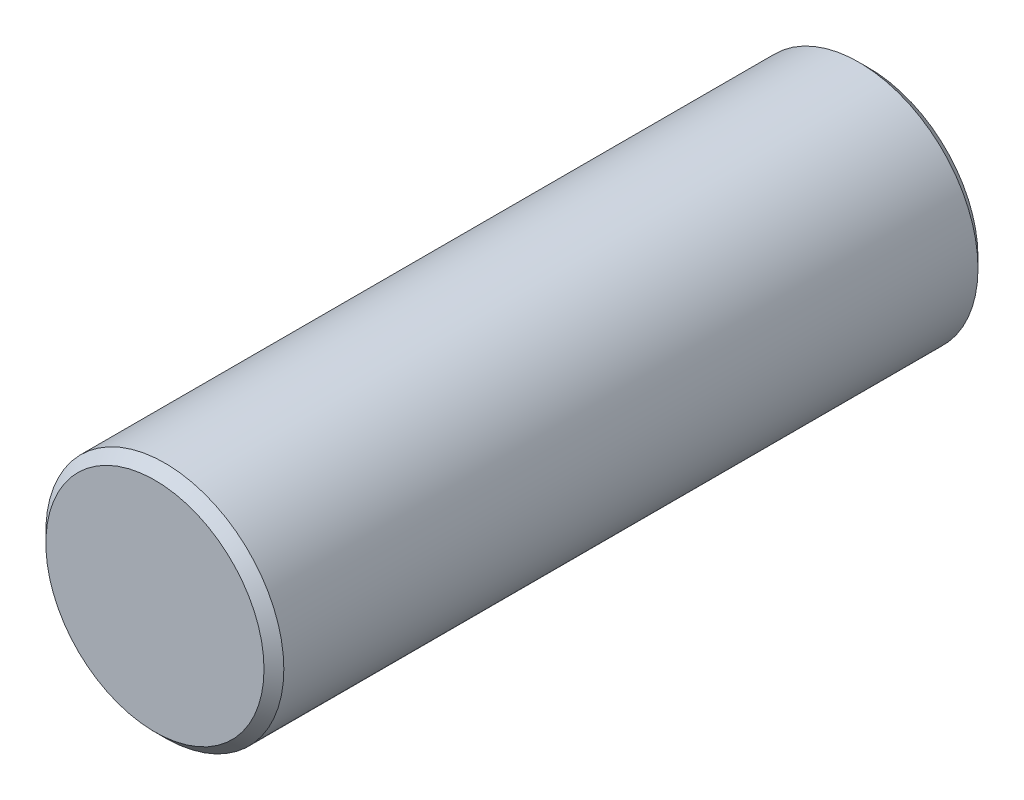
ISO-10303-21;
HEADER;
FILE_DESCRIPTION(('STEP AP214'),'2;1');
FILE_NAME('part.step','',(''),(''),'','','');
FILE_SCHEMA(('AUTOMOTIVE_DESIGN { 1 0 10303 214 1 1 1 1 }'));
ENDSEC;
DATA;
#1=APPLICATION_CONTEXT('core data for automotive mechanical design processes');
#2=APPLICATION_PROTOCOL_DEFINITION('international standard','automotive_design',2000,#1);
#3=PRODUCT_CONTEXT('',#1,'mechanical');
#4=PRODUCT('Part','Part','',(#3));
#5=PRODUCT_RELATED_PRODUCT_CATEGORY('part','',(#4));
#6=PRODUCT_DEFINITION_FORMATION('','',#4);
#7=PRODUCT_DEFINITION_CONTEXT('part definition',#1,'design');
#8=PRODUCT_DEFINITION('design','',#6,#7);
#9=PRODUCT_DEFINITION_SHAPE('','',#8);
#10=(LENGTH_UNIT() NAMED_UNIT(*) SI_UNIT(.MILLI.,.METRE.));
#11=(NAMED_UNIT(*) PLANE_ANGLE_UNIT() SI_UNIT($,.RADIAN.));
#12=(NAMED_UNIT(*) SI_UNIT($,.STERADIAN.) SOLID_ANGLE_UNIT());
#13=UNCERTAINTY_MEASURE_WITH_UNIT(LENGTH_MEASURE(1.E-05),#10,'distance_accuracy_value','');
#14=(GEOMETRIC_REPRESENTATION_CONTEXT(3) GLOBAL_UNCERTAINTY_ASSIGNED_CONTEXT((#13)) GLOBAL_UNIT_ASSIGNED_CONTEXT((#10,
#11,#12)) REPRESENTATION_CONTEXT('',''));
#15=CARTESIAN_POINT('',(0.,0.,0.));
#16=DIRECTION('',(0.,0.,1.));
#17=DIRECTION('',(1.,0.,0.));
#18=AXIS2_PLACEMENT_3D('',#15,#16,#17);
#19=CARTESIAN_POINT('',(0.,0.,4.5));
#20=DIRECTION('',(0.,0.,-1.));
#21=DIRECTION('',(-1.,0.,0.));
#22=AXIS2_PLACEMENT_3D('',#19,#20,#21);
#23=CYLINDRICAL_SURFACE('',#22,1.5);
#24=CARTESIAN_POINT('',(0.,0.,-4.375));
#25=DIRECTION('',(0.,0.,1.));
#26=DIRECTION('',(1.,0.,0.));
#27=AXIS2_PLACEMENT_3D('',#24,#25,#26);
#28=CIRCLE('',#27,1.5);
#29=CARTESIAN_POINT('',(1.5,0.,-4.375));
#30=VERTEX_POINT('',#29);
#31=EDGE_CURVE('E49',#30,#30,#28,.T.);
#32=ORIENTED_EDGE('',*,*,#31,.T.);
#33=EDGE_LOOP('',(#32));
#34=FACE_BOUND('',#33,.T.);
#35=CARTESIAN_POINT('',(0.,0.,4.375));
#36=DIRECTION('',(0.,0.,1.));
#37=DIRECTION('',(1.,0.,0.));
#38=AXIS2_PLACEMENT_3D('',#35,#36,#37);
#39=CIRCLE('',#38,1.5);
#40=CARTESIAN_POINT('',(1.5,0.,4.375));
#41=VERTEX_POINT('',#40);
#42=EDGE_CURVE('E53',#41,#41,#39,.F.);
#43=ORIENTED_EDGE('',*,*,#42,.T.);
#44=EDGE_LOOP('',(#43));
#45=FACE_BOUND('',#44,.T.);
#46=ADVANCED_FACE('F37',(#34,#45),#23,.T.);
#47=CARTESIAN_POINT('',(0.,0.,4.5));
#48=DIRECTION('',(0.,0.,1.));
#49=DIRECTION('',(1.,0.,0.));
#50=AXIS2_PLACEMENT_3D('',#47,#48,#49);
#51=PLANE('',#50);
#52=CARTESIAN_POINT('',(0.,0.,4.5));
#53=DIRECTION('',(0.,0.,1.));
#54=DIRECTION('',(1.,0.,0.));
#55=AXIS2_PLACEMENT_3D('',#52,#53,#54);
#56=CIRCLE('',#55,1.375);
#57=CARTESIAN_POINT('',(1.375,0.,4.5));
#58=VERTEX_POINT('',#57);
#59=EDGE_CURVE('E10',#58,#58,#56,.T.);
#60=ORIENTED_EDGE('',*,*,#59,.T.);
#61=EDGE_LOOP('',(#60));
#62=FACE_BOUND('',#61,.T.);
#63=ADVANCED_FACE('F69',(#62),#51,.T.);
#64=CARTESIAN_POINT('',(0.,0.,-4.5));
#65=DIRECTION('',(0.,0.,1.));
#66=DIRECTION('',(1.,0.,0.));
#67=AXIS2_PLACEMENT_3D('',#64,#65,#66);
#68=PLANE('',#67);
#69=CARTESIAN_POINT('',(0.,0.,-4.5));
#70=DIRECTION('',(0.,0.,1.));
#71=DIRECTION('',(1.,0.,0.));
#72=AXIS2_PLACEMENT_3D('',#69,#70,#71);
#73=CIRCLE('',#72,1.375);
#74=CARTESIAN_POINT('',(1.375,0.,-4.5));
#75=VERTEX_POINT('',#74);
#76=EDGE_CURVE('E45',#75,#75,#73,.F.);
#77=ORIENTED_EDGE('',*,*,#76,.T.);
#78=EDGE_LOOP('',(#77));
#79=FACE_BOUND('',#78,.T.);
#80=ADVANCED_FACE('F66',(#79),#68,.F.);
#81=CARTESIAN_POINT('',(0.,0.,-4.375));
#82=DIRECTION('',(0.,0.,1.));
#83=DIRECTION('',(1.,0.,0.));
#84=AXIS2_PLACEMENT_3D('',#81,#82,#83);
#85=CONICAL_SURFACE('',#84,1.5,0.785398163397457);
#86=ORIENTED_EDGE('',*,*,#76,.F.);
#87=EDGE_LOOP('',(#86));
#88=FACE_BOUND('',#87,.T.);
#89=ORIENTED_EDGE('',*,*,#31,.F.);
#90=EDGE_LOOP('',(#89));
#91=FACE_BOUND('',#90,.T.);
#92=ADVANCED_FACE('F62',(#88,#91),#85,.T.);
#93=CARTESIAN_POINT('',(0.,0.,4.5));
#94=DIRECTION('',(0.,0.,-1.));
#95=DIRECTION('',(-1.,0.,0.));
#96=AXIS2_PLACEMENT_3D('',#93,#94,#95);
#97=CONICAL_SURFACE('',#96,1.375,0.785398163397441);
#98=ORIENTED_EDGE('',*,*,#42,.F.);
#99=EDGE_LOOP('',(#98));
#100=FACE_BOUND('',#99,.T.);
#101=ORIENTED_EDGE('',*,*,#59,.F.);
#102=EDGE_LOOP('',(#101));
#103=FACE_BOUND('',#102,.T.);
#104=ADVANCED_FACE('F40',(#100,#103),#97,.T.);
#105=CLOSED_SHELL('',(#46,#63,#80,#92,#104));
#106=MANIFOLD_SOLID_BREP('B2',#105);
#107=ADVANCED_BREP_SHAPE_REPRESENTATION('',(#18,#106),#14);
#108=SHAPE_DEFINITION_REPRESENTATION(#9,#107);
ENDSEC;
END-ISO-10303-21;
